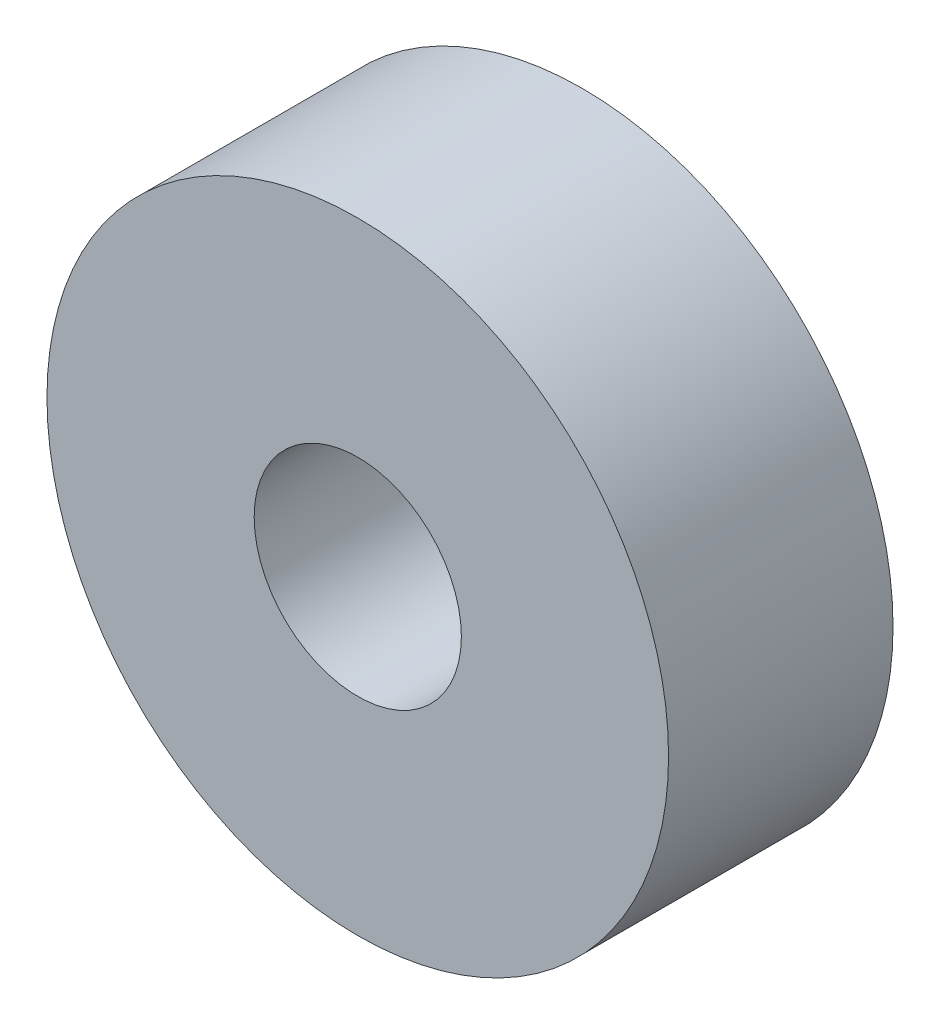
ISO-10303-21;
HEADER;
FILE_DESCRIPTION(('STEP AP214'),'2;1');
FILE_NAME('part.step','',(''),(''),'','','');
FILE_SCHEMA(('AUTOMOTIVE_DESIGN { 1 0 10303 214 1 1 1 1 }'));
ENDSEC;
DATA;
#1=APPLICATION_CONTEXT('core data for automotive mechanical design processes');
#2=APPLICATION_PROTOCOL_DEFINITION('international standard','automotive_design',2000,#1);
#3=PRODUCT_CONTEXT('',#1,'mechanical');
#4=PRODUCT('Part','Part','',(#3));
#5=PRODUCT_RELATED_PRODUCT_CATEGORY('part','',(#4));
#6=PRODUCT_DEFINITION_FORMATION('','',#4);
#7=PRODUCT_DEFINITION_CONTEXT('part definition',#1,'design');
#8=PRODUCT_DEFINITION('design','',#6,#7);
#9=PRODUCT_DEFINITION_SHAPE('','',#8);
#10=(LENGTH_UNIT() NAMED_UNIT(*) SI_UNIT(.MILLI.,.METRE.));
#11=(NAMED_UNIT(*) PLANE_ANGLE_UNIT() SI_UNIT($,.RADIAN.));
#12=(NAMED_UNIT(*) SI_UNIT($,.STERADIAN.) SOLID_ANGLE_UNIT());
#13=UNCERTAINTY_MEASURE_WITH_UNIT(LENGTH_MEASURE(1.E-05),#10,'distance_accuracy_value','');
#14=(GEOMETRIC_REPRESENTATION_CONTEXT(3) GLOBAL_UNCERTAINTY_ASSIGNED_CONTEXT((#13)) GLOBAL_UNIT_ASSIGNED_CONTEXT((#10,
#11,#12)) REPRESENTATION_CONTEXT('',''));
#15=CARTESIAN_POINT('',(0.,0.,0.));
#16=DIRECTION('',(0.,0.,1.));
#17=DIRECTION('',(1.,0.,0.));
#18=AXIS2_PLACEMENT_3D('',#15,#16,#17);
#19=CARTESIAN_POINT('',(0.,0.,6.5));
#20=DIRECTION('',(0.,0.,1.));
#21=DIRECTION('',(1.,0.,0.));
#22=AXIS2_PLACEMENT_3D('',#19,#20,#21);
#23=PLANE('',#22);
#24=CARTESIAN_POINT('',(0.,0.,6.5));
#25=DIRECTION('',(0.,0.,1.));
#26=DIRECTION('',(1.,0.,0.));
#27=AXIS2_PLACEMENT_3D('',#24,#25,#26);
#28=CIRCLE('',#27,9.);
#29=CARTESIAN_POINT('',(-9.,0.,6.5));
#30=VERTEX_POINT('',#29);
#31=EDGE_CURVE('E10',#30,#30,#28,.T.);
#32=ORIENTED_EDGE('',*,*,#31,.T.);
#33=EDGE_LOOP('',(#32));
#34=FACE_BOUND('',#33,.T.);
#35=CARTESIAN_POINT('',(0.,0.,6.5));
#36=DIRECTION('',(0.,0.,1.));
#37=DIRECTION('',(1.,0.,0.));
#38=AXIS2_PLACEMENT_3D('',#35,#36,#37);
#39=CIRCLE('',#38,3.);
#40=CARTESIAN_POINT('',(-3.,0.,6.5));
#41=VERTEX_POINT('',#40);
#42=EDGE_CURVE('E40',#41,#41,#39,.T.);
#43=ORIENTED_EDGE('',*,*,#42,.F.);
#44=EDGE_LOOP('',(#43));
#45=FACE_BOUND('',#44,.T.);
#46=ADVANCED_FACE('F29',(#34,#45),#23,.T.);
#47=CARTESIAN_POINT('',(0.,0.,0.));
#48=DIRECTION('',(0.,0.,1.));
#49=DIRECTION('',(1.,0.,0.));
#50=AXIS2_PLACEMENT_3D('',#47,#48,#49);
#51=PLANE('',#50);
#52=CARTESIAN_POINT('',(0.,0.,0.));
#53=DIRECTION('',(0.,0.,1.));
#54=DIRECTION('',(1.,0.,0.));
#55=AXIS2_PLACEMENT_3D('',#52,#53,#54);
#56=CIRCLE('',#55,9.);
#57=CARTESIAN_POINT('',(-9.,0.,0.));
#58=VERTEX_POINT('',#57);
#59=EDGE_CURVE('E33',#58,#58,#56,.T.);
#60=ORIENTED_EDGE('',*,*,#59,.F.);
#61=EDGE_LOOP('',(#60));
#62=FACE_BOUND('',#61,.T.);
#63=CARTESIAN_POINT('',(0.,0.,0.));
#64=DIRECTION('',(0.,0.,1.));
#65=DIRECTION('',(1.,0.,0.));
#66=AXIS2_PLACEMENT_3D('',#63,#64,#65);
#67=CIRCLE('',#66,3.);
#68=CARTESIAN_POINT('',(-3.,0.,0.));
#69=VERTEX_POINT('',#68);
#70=EDGE_CURVE('E42',#69,#69,#67,.T.);
#71=ORIENTED_EDGE('',*,*,#70,.T.);
#72=EDGE_LOOP('',(#71));
#73=FACE_BOUND('',#72,.T.);
#74=ADVANCED_FACE('F52',(#62,#73),#51,.F.);
#75=CARTESIAN_POINT('',(0.,0.,6.5));
#76=DIRECTION('',(0.,0.,-1.));
#77=DIRECTION('',(-1.,0.,0.));
#78=AXIS2_PLACEMENT_3D('',#75,#76,#77);
#79=CYLINDRICAL_SURFACE('',#78,9.);
#80=CARTESIAN_POINT('',(-9.,0.,6.5));
#81=CARTESIAN_POINT('',(-9.,0.,6.43229166666667));
#82=CARTESIAN_POINT('',(-9.,0.,6.36458333333333));
#83=CARTESIAN_POINT('',(-9.,0.,6.22916666666667));
#84=CARTESIAN_POINT('',(-9.,0.,6.16145833333333));
#85=CARTESIAN_POINT('',(-9.,0.,6.02604166666667));
#86=CARTESIAN_POINT('',(-9.,0.,5.95833333333333));
#87=CARTESIAN_POINT('',(-9.,0.,5.82291666666667));
#88=CARTESIAN_POINT('',(-9.,0.,5.75520833333333));
#89=CARTESIAN_POINT('',(-9.,0.,5.61979166666667));
#90=CARTESIAN_POINT('',(-9.,0.,5.55208333333333));
#91=CARTESIAN_POINT('',(-9.,0.,5.41666666666667));
#92=CARTESIAN_POINT('',(-9.,0.,5.34895833333333));
#93=CARTESIAN_POINT('',(-9.,0.,5.21354166666667));
#94=CARTESIAN_POINT('',(-9.,0.,5.14583333333333));
#95=CARTESIAN_POINT('',(-9.,0.,5.01041666666667));
#96=CARTESIAN_POINT('',(-9.,0.,4.94270833333333));
#97=CARTESIAN_POINT('',(-9.,0.,4.80729166666667));
#98=CARTESIAN_POINT('',(-9.,0.,4.73958333333333));
#99=CARTESIAN_POINT('',(-9.,0.,4.60416666666667));
#100=CARTESIAN_POINT('',(-9.,0.,4.53645833333333));
#101=CARTESIAN_POINT('',(-9.,0.,4.40104166666667));
#102=CARTESIAN_POINT('',(-9.,0.,4.33333333333333));
#103=CARTESIAN_POINT('',(-9.,0.,4.19791666666667));
#104=CARTESIAN_POINT('',(-9.,0.,4.13020833333333));
#105=CARTESIAN_POINT('',(-9.,0.,3.99479166666667));
#106=CARTESIAN_POINT('',(-9.,0.,3.92708333333333));
#107=CARTESIAN_POINT('',(-9.,0.,3.79166666666667));
#108=CARTESIAN_POINT('',(-9.,0.,3.72395833333333));
#109=CARTESIAN_POINT('',(-9.,0.,3.58854166666667));
#110=CARTESIAN_POINT('',(-9.,0.,3.52083333333333));
#111=CARTESIAN_POINT('',(-9.,0.,3.38541666666667));
#112=CARTESIAN_POINT('',(-9.,0.,3.31770833333333));
#113=CARTESIAN_POINT('',(-9.,0.,3.18229166666667));
#114=CARTESIAN_POINT('',(-9.,0.,3.11458333333333));
#115=CARTESIAN_POINT('',(-9.,0.,2.97916666666667));
#116=CARTESIAN_POINT('',(-9.,0.,2.91145833333333));
#117=CARTESIAN_POINT('',(-9.,0.,2.77604166666667));
#118=CARTESIAN_POINT('',(-9.,0.,2.70833333333333));
#119=CARTESIAN_POINT('',(-9.,0.,2.57291666666667));
#120=CARTESIAN_POINT('',(-9.,0.,2.50520833333333));
#121=CARTESIAN_POINT('',(-9.,0.,2.36979166666667));
#122=CARTESIAN_POINT('',(-9.,0.,2.30208333333333));
#123=CARTESIAN_POINT('',(-9.,0.,2.16666666666667));
#124=CARTESIAN_POINT('',(-9.,0.,2.09895833333333));
#125=CARTESIAN_POINT('',(-9.,0.,1.96354166666667));
#126=CARTESIAN_POINT('',(-9.,0.,1.89583333333333));
#127=CARTESIAN_POINT('',(-9.,0.,1.76041666666667));
#128=CARTESIAN_POINT('',(-9.,0.,1.69270833333333));
#129=CARTESIAN_POINT('',(-9.,0.,1.55729166666667));
#130=CARTESIAN_POINT('',(-9.,0.,1.48958333333333));
#131=CARTESIAN_POINT('',(-9.,0.,1.35416666666667));
#132=CARTESIAN_POINT('',(-9.,0.,1.28645833333333));
#133=CARTESIAN_POINT('',(-9.,0.,1.15104166666667));
#134=CARTESIAN_POINT('',(-9.,0.,1.08333333333333));
#135=CARTESIAN_POINT('',(-9.,0.,0.947916666666667));
#136=CARTESIAN_POINT('',(-9.,0.,0.880208333333333));
#137=CARTESIAN_POINT('',(-9.,0.,0.744791666666667));
#138=CARTESIAN_POINT('',(-9.,0.,0.677083333333333));
#139=CARTESIAN_POINT('',(-9.,0.,0.541666666666667));
#140=CARTESIAN_POINT('',(-9.,0.,0.473958333333333));
#141=CARTESIAN_POINT('',(-9.,0.,0.338541666666667));
#142=CARTESIAN_POINT('',(-9.,0.,0.270833333333334));
#143=CARTESIAN_POINT('',(-9.,0.,0.135416666666667));
#144=CARTESIAN_POINT('',(-9.,0.,0.0677083333333334));
#145=CARTESIAN_POINT('',(-9.,0.,0.));
#146=B_SPLINE_CURVE_WITH_KNOTS('',3,(#80,#81,#82,#83,#84,#85,#86,#87,#88,#89,#90,#91,#92,#93,
#94,#95,#96,#97,#98,#99,#100,#101,#102,#103,#104,#105,#106,#107,#108,#109,#110,#111,#112,#113,
#114,#115,#116,#117,#118,#119,#120,#121,#122,#123,#124,#125,#126,#127,#128,#129,#130,#131,#132,
#133,#134,#135,#136,#137,#138,#139,#140,#141,#142,#143,#144,#145),.UNSPECIFIED.,.F.,.F.,(4,2,2,
2,2,2,2,2,2,2,2,2,2,2,2,2,2,2,2,2,2,2,2,2,2,2,2,2,2,2,2,2,4),(0.,0.203125,0.40625,
0.609375000000001,0.812500000000001,1.015625,1.21875,1.421875,1.625,1.828125,2.03125,2.234375,
2.4375,2.640625,2.84375,3.046875,3.25,3.453125,3.65625,3.859375,4.0625,4.265625,4.46875,
4.671875,4.875,5.078125,5.28125,5.484375,5.6875,5.890625,6.09375,6.296875,6.5),.UNSPECIFIED.);
#147=EDGE_CURVE('BSEAM31',#30,#58,#146,.T.);
#148=ORIENTED_EDGE('',*,*,#31,.F.);
#149=ORIENTED_EDGE('',*,*,#59,.T.);
#150=ORIENTED_EDGE('',*,*,#147,.T.);
#151=ORIENTED_EDGE('',*,*,#147,.F.);
#152=EDGE_LOOP('',(#148,#150,#149,#151));
#153=FACE_BOUND('',#152,.T.);
#154=ADVANCED_FACE('F31',(#153),#79,.T.);
#155=CARTESIAN_POINT('',(0.,0.,6.5));
#156=DIRECTION('',(0.,0.,-1.));
#157=DIRECTION('',(-1.,0.,0.));
#158=AXIS2_PLACEMENT_3D('',#155,#156,#157);
#159=CYLINDRICAL_SURFACE('',#158,3.);
#160=CARTESIAN_POINT('',(-3.,0.,6.5));
#161=CARTESIAN_POINT('',(-3.,0.,6.43229166666667));
#162=CARTESIAN_POINT('',(-3.,0.,6.36458333333333));
#163=CARTESIAN_POINT('',(-3.,0.,6.22916666666667));
#164=CARTESIAN_POINT('',(-3.,0.,6.16145833333333));
#165=CARTESIAN_POINT('',(-3.,0.,6.02604166666667));
#166=CARTESIAN_POINT('',(-3.,0.,5.95833333333333));
#167=CARTESIAN_POINT('',(-3.,0.,5.82291666666667));
#168=CARTESIAN_POINT('',(-3.,0.,5.75520833333333));
#169=CARTESIAN_POINT('',(-3.,0.,5.61979166666667));
#170=CARTESIAN_POINT('',(-3.,0.,5.55208333333333));
#171=CARTESIAN_POINT('',(-3.,0.,5.41666666666667));
#172=CARTESIAN_POINT('',(-3.,0.,5.34895833333333));
#173=CARTESIAN_POINT('',(-3.,0.,5.21354166666667));
#174=CARTESIAN_POINT('',(-3.,0.,5.14583333333333));
#175=CARTESIAN_POINT('',(-3.,0.,5.01041666666667));
#176=CARTESIAN_POINT('',(-3.,0.,4.94270833333333));
#177=CARTESIAN_POINT('',(-3.,0.,4.80729166666667));
#178=CARTESIAN_POINT('',(-3.,0.,4.73958333333333));
#179=CARTESIAN_POINT('',(-3.,0.,4.60416666666667));
#180=CARTESIAN_POINT('',(-3.,0.,4.53645833333333));
#181=CARTESIAN_POINT('',(-3.,0.,4.40104166666667));
#182=CARTESIAN_POINT('',(-3.,0.,4.33333333333333));
#183=CARTESIAN_POINT('',(-3.,0.,4.19791666666667));
#184=CARTESIAN_POINT('',(-3.,0.,4.13020833333333));
#185=CARTESIAN_POINT('',(-3.,0.,3.99479166666667));
#186=CARTESIAN_POINT('',(-3.,0.,3.92708333333333));
#187=CARTESIAN_POINT('',(-3.,0.,3.79166666666667));
#188=CARTESIAN_POINT('',(-3.,0.,3.72395833333333));
#189=CARTESIAN_POINT('',(-3.,0.,3.58854166666667));
#190=CARTESIAN_POINT('',(-3.,0.,3.52083333333333));
#191=CARTESIAN_POINT('',(-3.,0.,3.38541666666667));
#192=CARTESIAN_POINT('',(-3.,0.,3.31770833333333));
#193=CARTESIAN_POINT('',(-3.,0.,3.18229166666667));
#194=CARTESIAN_POINT('',(-3.,0.,3.11458333333333));
#195=CARTESIAN_POINT('',(-3.,0.,2.97916666666667));
#196=CARTESIAN_POINT('',(-3.,0.,2.91145833333333));
#197=CARTESIAN_POINT('',(-3.,0.,2.77604166666667));
#198=CARTESIAN_POINT('',(-3.,0.,2.70833333333333));
#199=CARTESIAN_POINT('',(-3.,0.,2.57291666666667));
#200=CARTESIAN_POINT('',(-3.,0.,2.50520833333333));
#201=CARTESIAN_POINT('',(-3.,0.,2.36979166666667));
#202=CARTESIAN_POINT('',(-3.,0.,2.30208333333333));
#203=CARTESIAN_POINT('',(-3.,0.,2.16666666666667));
#204=CARTESIAN_POINT('',(-3.,0.,2.09895833333333));
#205=CARTESIAN_POINT('',(-3.,0.,1.96354166666667));
#206=CARTESIAN_POINT('',(-3.,0.,1.89583333333333));
#207=CARTESIAN_POINT('',(-3.,0.,1.76041666666667));
#208=CARTESIAN_POINT('',(-3.,0.,1.69270833333333));
#209=CARTESIAN_POINT('',(-3.,0.,1.55729166666667));
#210=CARTESIAN_POINT('',(-3.,0.,1.48958333333333));
#211=CARTESIAN_POINT('',(-3.,0.,1.35416666666667));
#212=CARTESIAN_POINT('',(-3.,0.,1.28645833333333));
#213=CARTESIAN_POINT('',(-3.,0.,1.15104166666667));
#214=CARTESIAN_POINT('',(-3.,0.,1.08333333333333));
#215=CARTESIAN_POINT('',(-3.,0.,0.947916666666667));
#216=CARTESIAN_POINT('',(-3.,0.,0.880208333333333));
#217=CARTESIAN_POINT('',(-3.,0.,0.744791666666667));
#218=CARTESIAN_POINT('',(-3.,0.,0.677083333333333));
#219=CARTESIAN_POINT('',(-3.,0.,0.541666666666667));
#220=CARTESIAN_POINT('',(-3.,0.,0.473958333333333));
#221=CARTESIAN_POINT('',(-3.,0.,0.338541666666667));
#222=CARTESIAN_POINT('',(-3.,0.,0.270833333333334));
#223=CARTESIAN_POINT('',(-3.,0.,0.135416666666667));
#224=CARTESIAN_POINT('',(-3.,0.,0.0677083333333334));
#225=CARTESIAN_POINT('',(-3.,0.,0.));
#226=B_SPLINE_CURVE_WITH_KNOTS('',3,(#160,#161,#162,#163,#164,#165,#166,#167,#168,#169,#170,
#171,#172,#173,#174,#175,#176,#177,#178,#179,#180,#181,#182,#183,#184,#185,#186,#187,#188,#189,
#190,#191,#192,#193,#194,#195,#196,#197,#198,#199,#200,#201,#202,#203,#204,#205,#206,#207,#208,
#209,#210,#211,#212,#213,#214,#215,#216,#217,#218,#219,#220,#221,#222,#223,#224,#225),
.UNSPECIFIED.,.F.,.F.,(4,2,2,2,2,2,2,2,2,2,2,2,2,2,2,2,2,2,2,2,2,2,2,2,2,2,2,2,2,2,2,2,4),(0.,
0.203125,0.40625,0.609375000000001,0.812500000000001,1.015625,1.21875,1.421875,1.625,1.828125,
2.03125,2.234375,2.4375,2.640625,2.84375,3.046875,3.25,3.453125,3.65625,3.859375,4.0625,
4.265625,4.46875,4.671875,4.875,5.078125,5.28125,5.484375,5.6875,5.890625,6.09375,6.296875,6.5),.UNSPECIFIED.);
#227=EDGE_CURVE('BSEAM48',#41,#69,#226,.T.);
#228=ORIENTED_EDGE('',*,*,#42,.T.);
#229=ORIENTED_EDGE('',*,*,#70,.F.);
#230=ORIENTED_EDGE('',*,*,#227,.T.);
#231=ORIENTED_EDGE('',*,*,#227,.F.);
#232=EDGE_LOOP('',(#228,#230,#229,#231));
#233=FACE_BOUND('',#232,.T.);
#234=ADVANCED_FACE('F48',(#233),#159,.F.);
#235=CLOSED_SHELL('',(#46,#74,#154,#234));
#236=MANIFOLD_SOLID_BREP('B2',#235);
#237=ADVANCED_BREP_SHAPE_REPRESENTATION('',(#18,#236),#14);
#238=SHAPE_DEFINITION_REPRESENTATION(#9,#237);
ENDSEC;
END-ISO-10303-21;
